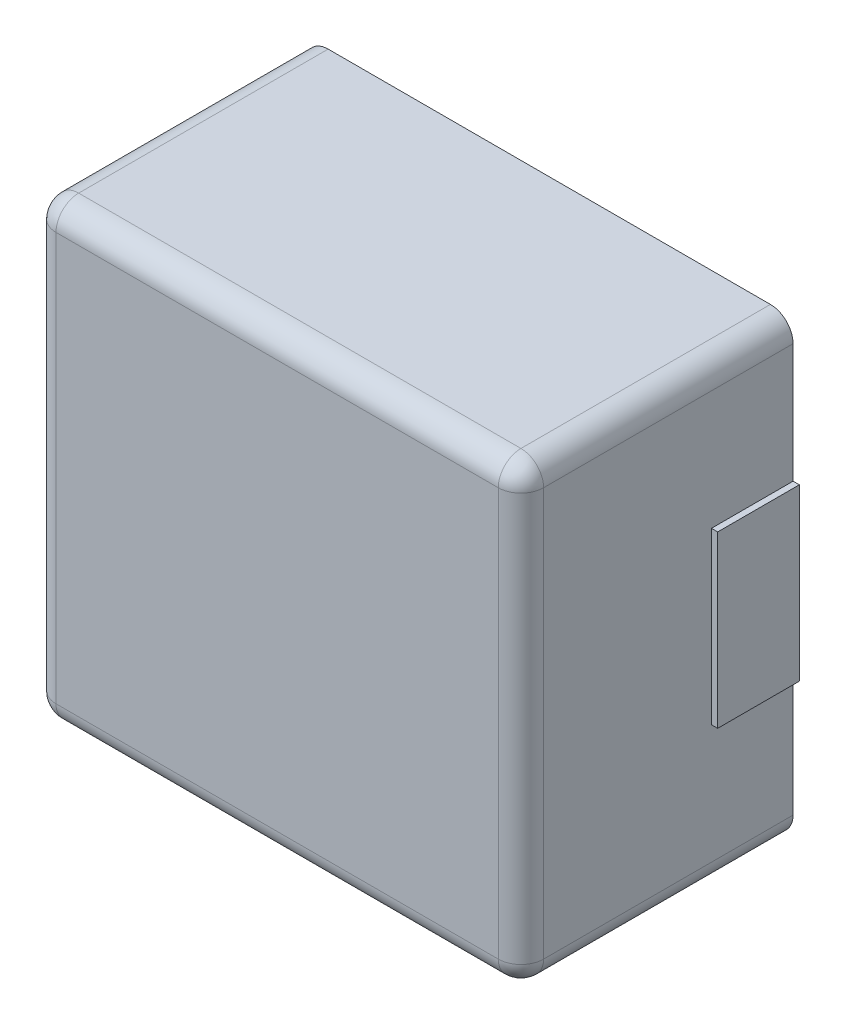
ISO-10303-21;
HEADER;
FILE_DESCRIPTION(('STEP AP214'),'2;1');
FILE_NAME('part.step','',(''),(''),'','','');
FILE_SCHEMA(('AUTOMOTIVE_DESIGN { 1 0 10303 214 1 1 1 1 }'));
ENDSEC;
DATA;
#1=APPLICATION_CONTEXT('core data for automotive mechanical design processes');
#2=APPLICATION_PROTOCOL_DEFINITION('international standard','automotive_design',2000,#1);
#3=PRODUCT_CONTEXT('',#1,'mechanical');
#4=PRODUCT('Part','Part','',(#3));
#5=PRODUCT_RELATED_PRODUCT_CATEGORY('part','',(#4));
#6=PRODUCT_DEFINITION_FORMATION('','',#4);
#7=PRODUCT_DEFINITION_CONTEXT('part definition',#1,'design');
#8=PRODUCT_DEFINITION('design','',#6,#7);
#9=PRODUCT_DEFINITION_SHAPE('','',#8);
#10=(LENGTH_UNIT() NAMED_UNIT(*) SI_UNIT(.MILLI.,.METRE.));
#11=(NAMED_UNIT(*) PLANE_ANGLE_UNIT() SI_UNIT($,.RADIAN.));
#12=(NAMED_UNIT(*) SI_UNIT($,.STERADIAN.) SOLID_ANGLE_UNIT());
#13=UNCERTAINTY_MEASURE_WITH_UNIT(LENGTH_MEASURE(1.E-05),#10,'distance_accuracy_value','');
#14=(GEOMETRIC_REPRESENTATION_CONTEXT(3) GLOBAL_UNCERTAINTY_ASSIGNED_CONTEXT((#13)) GLOBAL_UNIT_ASSIGNED_CONTEXT((#10,
#11,#12)) REPRESENTATION_CONTEXT('',''));
#15=CARTESIAN_POINT('',(0.,0.,0.));
#16=DIRECTION('',(0.,0.,1.));
#17=DIRECTION('',(1.,0.,0.));
#18=AXIS2_PLACEMENT_3D('',#15,#16,#17);
#19=CARTESIAN_POINT('',(3.9,-3.6,4.4));
#20=DIRECTION('',(0.,0.,-1.));
#21=DIRECTION('',(0.,-1.,0.));
#22=AXIS2_PLACEMENT_3D('',#19,#20,#21);
#23=SPHERICAL_SURFACE('',#22,0.4);
#24=CARTESIAN_POINT('',(3.9,-3.6,4.4));
#25=DIRECTION('',(0.,0.,1.));
#26=DIRECTION('',(0.,-1.,0.));
#27=AXIS2_PLACEMENT_3D('',#24,#25,#26);
#28=CIRCLE('',#27,0.4);
#29=CARTESIAN_POINT('',(3.9,-4.,4.4));
#30=VERTEX_POINT('',#29);
#31=CARTESIAN_POINT('',(4.3,-3.6,4.4));
#32=VERTEX_POINT('',#31);
#33=EDGE_CURVE('E131',#30,#32,#28,.T.);
#34=ORIENTED_EDGE('',*,*,#33,.T.);
#35=CARTESIAN_POINT('',(3.9,-3.6,4.4));
#36=DIRECTION('',(0.,1.,0.));
#37=DIRECTION('',(1.,0.,0.));
#38=AXIS2_PLACEMENT_3D('',#35,#36,#37);
#39=CIRCLE('',#38,0.4);
#40=CARTESIAN_POINT('',(3.9,-3.6,4.8));
#41=VERTEX_POINT('',#40);
#42=EDGE_CURVE('E261',#41,#32,#39,.T.);
#43=ORIENTED_EDGE('',*,*,#42,.F.);
#44=CARTESIAN_POINT('',(3.9,-3.6,4.4));
#45=DIRECTION('',(1.,0.,0.));
#46=DIRECTION('',(0.,0.,1.));
#47=AXIS2_PLACEMENT_3D('',#44,#45,#46);
#48=CIRCLE('',#47,0.4);
#49=EDGE_CURVE('E210',#41,#30,#48,.T.);
#50=ORIENTED_EDGE('',*,*,#49,.T.);
#51=EDGE_LOOP('',(#34,#43,#50));
#52=FACE_BOUND('',#51,.T.);
#53=ADVANCED_FACE('F17',(#52),#23,.T.);
#54=CARTESIAN_POINT('',(4.41,-1.5,0.));
#55=DIRECTION('',(1.,0.,0.));
#56=DIRECTION('',(0.,1.,0.));
#57=AXIS2_PLACEMENT_3D('',#54,#55,#56);
#58=PLANE('',#57);
#59=DIRECTION('',(0.,0.,1.));
#60=VECTOR('',#59,1.);
#61=CARTESIAN_POINT('',(4.41,-1.5,0.));
#62=LINE('',#61,#60);
#63=CARTESIAN_POINT('',(4.41,-1.5,0.));
#64=VERTEX_POINT('',#63);
#65=CARTESIAN_POINT('',(4.41,-1.5,1.44));
#66=VERTEX_POINT('',#65);
#67=EDGE_CURVE('E11',#64,#66,#62,.T.);
#68=ORIENTED_EDGE('',*,*,#67,.F.);
#69=DIRECTION('',(0.,1.,0.));
#70=VECTOR('',#69,1.);
#71=CARTESIAN_POINT('',(4.41,-1.5,0.));
#72=LINE('',#71,#70);
#73=CARTESIAN_POINT('',(4.41,1.5,0.));
#74=VERTEX_POINT('',#73);
#75=EDGE_CURVE('E119',#64,#74,#72,.T.);
#76=ORIENTED_EDGE('',*,*,#75,.T.);
#77=DIRECTION('',(0.,0.,1.));
#78=VECTOR('',#77,1.);
#79=CARTESIAN_POINT('',(4.41,1.5,0.));
#80=LINE('',#79,#78);
#81=CARTESIAN_POINT('',(4.41,1.5,1.44));
#82=VERTEX_POINT('',#81);
#83=EDGE_CURVE('E235',#74,#82,#80,.T.);
#84=ORIENTED_EDGE('',*,*,#83,.T.);
#85=DIRECTION('',(0.,1.,0.));
#86=VECTOR('',#85,1.);
#87=CARTESIAN_POINT('',(4.41,-1.5,1.44));
#88=LINE('',#87,#86);
#89=EDGE_CURVE('E25',#66,#82,#88,.T.);
#90=ORIENTED_EDGE('',*,*,#89,.F.);
#91=EDGE_LOOP('',(#68,#76,#84,#90));
#92=FACE_BOUND('',#91,.T.);
#93=ADVANCED_FACE('F117',(#92),#58,.T.);
#94=CARTESIAN_POINT('',(2.61,-1.5,0.));
#95=DIRECTION('',(0.,1.,0.));
#96=DIRECTION('',(1.,0.,0.));
#97=AXIS2_PLACEMENT_3D('',#94,#95,#96);
#98=PLANE('',#97);
#99=ORIENTED_EDGE('',*,*,#67,.T.);
#100=DIRECTION('',(1.,0.,0.));
#101=VECTOR('',#100,1.);
#102=CARTESIAN_POINT('',(2.61,-1.5,1.44));
#103=LINE('',#102,#101);
#104=CARTESIAN_POINT('',(4.3,-1.5,1.44));
#105=VERTEX_POINT('',#104);
#106=EDGE_CURVE('E232',#105,#66,#103,.T.);
#107=ORIENTED_EDGE('',*,*,#106,.F.);
#108=DIRECTION('',(0.,0.,1.));
#109=VECTOR('',#108,1.);
#110=CARTESIAN_POINT('',(4.3,-1.5,0.));
#111=LINE('',#110,#109);
#112=CARTESIAN_POINT('',(4.3,-1.5,0.));
#113=VERTEX_POINT('',#112);
#114=EDGE_CURVE('E126',#113,#105,#111,.T.);
#115=ORIENTED_EDGE('',*,*,#114,.F.);
#116=DIRECTION('',(1.,0.,0.));
#117=VECTOR('',#116,1.);
#118=CARTESIAN_POINT('',(2.61,-1.5,0.));
#119=LINE('',#118,#117);
#120=EDGE_CURVE('E123',#113,#64,#119,.T.);
#121=ORIENTED_EDGE('',*,*,#120,.T.);
#122=EDGE_LOOP('',(#99,#107,#115,#121));
#123=FACE_BOUND('',#122,.T.);
#124=ADVANCED_FACE('F124',(#123),#98,.F.);
#125=CARTESIAN_POINT('',(2.61,-1.5,1.44));
#126=DIRECTION('',(0.,0.,1.));
#127=DIRECTION('',(1.,0.,0.));
#128=AXIS2_PLACEMENT_3D('',#125,#126,#127);
#129=PLANE('',#128);
#130=DIRECTION('',(0.,-1.,0.));
#131=VECTOR('',#130,1.);
#132=CARTESIAN_POINT('',(4.3,-2.75,1.44));
#133=LINE('',#132,#131);
#134=CARTESIAN_POINT('',(4.3,1.5,1.44));
#135=VERTEX_POINT('',#134);
#136=EDGE_CURVE('E249',#135,#105,#133,.T.);
#137=ORIENTED_EDGE('',*,*,#136,.T.);
#138=ORIENTED_EDGE('',*,*,#106,.T.);
#139=ORIENTED_EDGE('',*,*,#89,.T.);
#140=DIRECTION('',(1.,0.,0.));
#141=VECTOR('',#140,1.);
#142=CARTESIAN_POINT('',(2.61,1.5,1.44));
#143=LINE('',#142,#141);
#144=EDGE_CURVE('E213',#135,#82,#143,.T.);
#145=ORIENTED_EDGE('',*,*,#144,.F.);
#146=EDGE_LOOP('',(#137,#138,#139,#145));
#147=FACE_BOUND('',#146,.T.);
#148=ADVANCED_FACE('F468',(#147),#129,.T.);
#149=CARTESIAN_POINT('',(2.61,1.5,0.));
#150=DIRECTION('',(0.,1.,0.));
#151=DIRECTION('',(1.,0.,0.));
#152=AXIS2_PLACEMENT_3D('',#149,#150,#151);
#153=PLANE('',#152);
#154=DIRECTION('',(1.,0.,0.));
#155=VECTOR('',#154,1.);
#156=CARTESIAN_POINT('',(2.61,1.5,0.));
#157=LINE('',#156,#155);
#158=CARTESIAN_POINT('',(4.3,1.5,0.));
#159=VERTEX_POINT('',#158);
#160=EDGE_CURVE('E136',#159,#74,#157,.T.);
#161=ORIENTED_EDGE('',*,*,#160,.F.);
#162=DIRECTION('',(0.,0.,1.));
#163=VECTOR('',#162,1.);
#164=CARTESIAN_POINT('',(4.3,1.5,0.));
#165=LINE('',#164,#163);
#166=EDGE_CURVE('E143',#159,#135,#165,.T.);
#167=ORIENTED_EDGE('',*,*,#166,.T.);
#168=ORIENTED_EDGE('',*,*,#144,.T.);
#169=ORIENTED_EDGE('',*,*,#83,.F.);
#170=EDGE_LOOP('',(#161,#167,#168,#169));
#171=FACE_BOUND('',#170,.T.);
#172=ADVANCED_FACE('F459',(#171),#153,.T.);
#173=CARTESIAN_POINT('',(3.9,3.6,4.4));
#174=DIRECTION('',(0.,0.,-1.));
#175=DIRECTION('',(1.,0.,0.));
#176=AXIS2_PLACEMENT_3D('',#173,#174,#175);
#177=SPHERICAL_SURFACE('',#176,0.4);
#178=CARTESIAN_POINT('',(3.9,3.6,4.4));
#179=DIRECTION('',(0.,0.,1.));
#180=DIRECTION('',(1.,0.,0.));
#181=AXIS2_PLACEMENT_3D('',#178,#179,#180);
#182=CIRCLE('',#181,0.4);
#183=CARTESIAN_POINT('',(4.3,3.6,4.4));
#184=VERTEX_POINT('',#183);
#185=CARTESIAN_POINT('',(3.9,4.,4.4));
#186=VERTEX_POINT('',#185);
#187=EDGE_CURVE('E160',#184,#186,#182,.T.);
#188=ORIENTED_EDGE('',*,*,#187,.T.);
#189=CARTESIAN_POINT('',(3.9,3.6,4.4));
#190=DIRECTION('',(-1.,0.,0.));
#191=DIRECTION('',(0.,1.,0.));
#192=AXIS2_PLACEMENT_3D('',#189,#190,#191);
#193=CIRCLE('',#192,0.4);
#194=CARTESIAN_POINT('',(3.9,3.6,4.8));
#195=VERTEX_POINT('',#194);
#196=EDGE_CURVE('E258',#195,#186,#193,.T.);
#197=ORIENTED_EDGE('',*,*,#196,.F.);
#198=CARTESIAN_POINT('',(3.9,3.6,4.4));
#199=DIRECTION('',(0.,1.,0.));
#200=DIRECTION('',(1.,0.,0.));
#201=AXIS2_PLACEMENT_3D('',#198,#199,#200);
#202=CIRCLE('',#201,0.4);
#203=EDGE_CURVE('E214',#195,#184,#202,.T.);
#204=ORIENTED_EDGE('',*,*,#203,.T.);
#205=EDGE_LOOP('',(#188,#197,#204));
#206=FACE_BOUND('',#205,.T.);
#207=ADVANCED_FACE('F450',(#206),#177,.T.);
#208=CARTESIAN_POINT('',(-3.9,-3.6,4.4));
#209=DIRECTION('',(1.,0.,0.));
#210=DIRECTION('',(0.,0.,1.));
#211=AXIS2_PLACEMENT_3D('',#208,#209,#210);
#212=CYLINDRICAL_SURFACE('',#211,0.4);
#213=CARTESIAN_POINT('',(-3.9,-3.6,4.4));
#214=DIRECTION('',(1.,0.,0.));
#215=DIRECTION('',(0.,-1.,0.));
#216=AXIS2_PLACEMENT_3D('',#213,#214,#215);
#217=CIRCLE('',#216,0.4);
#218=CARTESIAN_POINT('',(-3.9,-3.6,4.8));
#219=VERTEX_POINT('',#218);
#220=CARTESIAN_POINT('',(-3.9,-4.,4.4));
#221=VERTEX_POINT('',#220);
#222=EDGE_CURVE('E183',#219,#221,#217,.T.);
#223=ORIENTED_EDGE('',*,*,#222,.T.);
#224=DIRECTION('',(1.,0.,0.));
#225=VECTOR('',#224,1.);
#226=CARTESIAN_POINT('',(-3.9,-4.,4.4));
#227=LINE('',#226,#225);
#228=EDGE_CURVE('E257',#221,#30,#227,.T.);
#229=ORIENTED_EDGE('',*,*,#228,.T.);
#230=ORIENTED_EDGE('',*,*,#49,.F.);
#231=DIRECTION('',(1.,0.,0.));
#232=VECTOR('',#231,1.);
#233=CARTESIAN_POINT('',(-3.9,-3.6,4.8));
#234=LINE('',#233,#232);
#235=EDGE_CURVE('E231',#219,#41,#234,.T.);
#236=ORIENTED_EDGE('',*,*,#235,.F.);
#237=EDGE_LOOP('',(#223,#229,#230,#236));
#238=FACE_BOUND('',#237,.T.);
#239=ADVANCED_FACE('F441',(#238),#212,.T.);
#240=CARTESIAN_POINT('',(3.9,-3.6,4.4));
#241=DIRECTION('',(0.,1.,0.));
#242=DIRECTION('',(0.,0.,1.));
#243=AXIS2_PLACEMENT_3D('',#240,#241,#242);
#244=CYLINDRICAL_SURFACE('',#243,0.4);
#245=ORIENTED_EDGE('',*,*,#42,.T.);
#246=DIRECTION('',(0.,1.,0.));
#247=VECTOR('',#246,1.);
#248=CARTESIAN_POINT('',(4.3,-3.6,4.4));
#249=LINE('',#248,#247);
#250=EDGE_CURVE('E164',#32,#184,#249,.T.);
#251=ORIENTED_EDGE('',*,*,#250,.T.);
#252=ORIENTED_EDGE('',*,*,#203,.F.);
#253=DIRECTION('',(0.,1.,0.));
#254=VECTOR('',#253,1.);
#255=CARTESIAN_POINT('',(3.9,-3.6,4.8));
#256=LINE('',#255,#254);
#257=EDGE_CURVE('E239',#41,#195,#256,.T.);
#258=ORIENTED_EDGE('',*,*,#257,.F.);
#259=EDGE_LOOP('',(#245,#251,#252,#258));
#260=FACE_BOUND('',#259,.T.);
#261=ADVANCED_FACE('F432',(#260),#244,.T.);
#262=CARTESIAN_POINT('',(3.9,3.6,4.4));
#263=DIRECTION('',(-1.,0.,0.));
#264=DIRECTION('',(0.,0.,1.));
#265=AXIS2_PLACEMENT_3D('',#262,#263,#264);
#266=CYLINDRICAL_SURFACE('',#265,0.4);
#267=ORIENTED_EDGE('',*,*,#196,.T.);
#268=DIRECTION('',(-1.,0.,0.));
#269=VECTOR('',#268,1.);
#270=CARTESIAN_POINT('',(3.9,4.,4.4));
#271=LINE('',#270,#269);
#272=CARTESIAN_POINT('',(-3.9,4.,4.4));
#273=VERTEX_POINT('',#272);
#274=EDGE_CURVE('E178',#186,#273,#271,.T.);
#275=ORIENTED_EDGE('',*,*,#274,.T.);
#276=CARTESIAN_POINT('',(-3.9,3.6,4.4));
#277=DIRECTION('',(-1.,0.,0.));
#278=DIRECTION('',(0.,0.,1.));
#279=AXIS2_PLACEMENT_3D('',#276,#277,#278);
#280=CIRCLE('',#279,0.4);
#281=CARTESIAN_POINT('',(-3.9,3.6,4.8));
#282=VERTEX_POINT('',#281);
#283=EDGE_CURVE('E226',#282,#273,#280,.T.);
#284=ORIENTED_EDGE('',*,*,#283,.F.);
#285=DIRECTION('',(-1.,0.,0.));
#286=VECTOR('',#285,1.);
#287=CARTESIAN_POINT('',(3.9,3.6,4.8));
#288=LINE('',#287,#286);
#289=EDGE_CURVE('E227',#195,#282,#288,.T.);
#290=ORIENTED_EDGE('',*,*,#289,.F.);
#291=EDGE_LOOP('',(#267,#275,#284,#290));
#292=FACE_BOUND('',#291,.T.);
#293=ADVANCED_FACE('F423',(#292),#266,.T.);
#294=CARTESIAN_POINT('',(-4.41,-1.5,0.));
#295=DIRECTION('',(1.,0.,0.));
#296=DIRECTION('',(0.,1.,0.));
#297=AXIS2_PLACEMENT_3D('',#294,#295,#296);
#298=PLANE('',#297);
#299=DIRECTION('',(0.,1.,0.));
#300=VECTOR('',#299,1.);
#301=CARTESIAN_POINT('',(-4.41,-1.5,1.44));
#302=LINE('',#301,#300);
#303=CARTESIAN_POINT('',(-4.41,-1.5,1.44));
#304=VERTEX_POINT('',#303);
#305=CARTESIAN_POINT('',(-4.41,1.5,1.44));
#306=VERTEX_POINT('',#305);
#307=EDGE_CURVE('E195',#304,#306,#302,.T.);
#308=ORIENTED_EDGE('',*,*,#307,.T.);
#309=DIRECTION('',(0.,0.,1.));
#310=VECTOR('',#309,1.);
#311=CARTESIAN_POINT('',(-4.41,1.5,0.));
#312=LINE('',#311,#310);
#313=CARTESIAN_POINT('',(-4.41,1.5,0.));
#314=VERTEX_POINT('',#313);
#315=EDGE_CURVE('E187',#314,#306,#312,.T.);
#316=ORIENTED_EDGE('',*,*,#315,.F.);
#317=DIRECTION('',(0.,1.,0.));
#318=VECTOR('',#317,1.);
#319=CARTESIAN_POINT('',(-4.41,-1.5,0.));
#320=LINE('',#319,#318);
#321=CARTESIAN_POINT('',(-4.41,-1.5,0.));
#322=VERTEX_POINT('',#321);
#323=EDGE_CURVE('E246',#322,#314,#320,.T.);
#324=ORIENTED_EDGE('',*,*,#323,.F.);
#325=DIRECTION('',(0.,0.,1.));
#326=VECTOR('',#325,1.);
#327=CARTESIAN_POINT('',(-4.41,-1.5,0.));
#328=LINE('',#327,#326);
#329=EDGE_CURVE('E202',#322,#304,#328,.T.);
#330=ORIENTED_EDGE('',*,*,#329,.T.);
#331=EDGE_LOOP('',(#308,#316,#324,#330));
#332=FACE_BOUND('',#331,.T.);
#333=ADVANCED_FACE('F414',(#332),#298,.F.);
#334=CARTESIAN_POINT('',(-4.3,-4.,0.));
#335=DIRECTION('',(0.,1.,0.));
#336=DIRECTION('',(1.,0.,0.));
#337=AXIS2_PLACEMENT_3D('',#334,#335,#336);
#338=PLANE('',#337);
#339=DIRECTION('',(1.,0.,0.));
#340=VECTOR('',#339,1.);
#341=CARTESIAN_POINT('',(-4.3,-4.,0.));
#342=LINE('',#341,#340);
#343=CARTESIAN_POINT('',(-3.9,-4.,0.));
#344=VERTEX_POINT('',#343);
#345=CARTESIAN_POINT('',(3.9,-4.,0.));
#346=VERTEX_POINT('',#345);
#347=EDGE_CURVE('E169',#344,#346,#342,.T.);
#348=ORIENTED_EDGE('',*,*,#347,.T.);
#349=DIRECTION('',(0.,0.,1.));
#350=VECTOR('',#349,1.);
#351=CARTESIAN_POINT('',(3.9,-4.,0.));
#352=LINE('',#351,#350);
#353=EDGE_CURVE('E253',#346,#30,#352,.T.);
#354=ORIENTED_EDGE('',*,*,#353,.T.);
#355=ORIENTED_EDGE('',*,*,#228,.F.);
#356=DIRECTION('',(0.,0.,1.));
#357=VECTOR('',#356,1.);
#358=CARTESIAN_POINT('',(-3.9,-4.,0.));
#359=LINE('',#358,#357);
#360=EDGE_CURVE('E209',#344,#221,#359,.T.);
#361=ORIENTED_EDGE('',*,*,#360,.F.);
#362=EDGE_LOOP('',(#348,#354,#355,#361));
#363=FACE_BOUND('',#362,.T.);
#364=ADVANCED_FACE('F405',(#363),#338,.F.);
#365=CARTESIAN_POINT('',(3.9,-3.6,0.));
#366=DIRECTION('',(0.,0.,1.));
#367=DIRECTION('',(1.,0.,0.));
#368=AXIS2_PLACEMENT_3D('',#365,#366,#367);
#369=CYLINDRICAL_SURFACE('',#368,0.4);
#370=ORIENTED_EDGE('',*,*,#33,.F.);
#371=ORIENTED_EDGE('',*,*,#353,.F.);
#372=CARTESIAN_POINT('',(3.9,-3.6,0.));
#373=DIRECTION('',(0.,0.,-1.));
#374=DIRECTION('',(0.,-1.,0.));
#375=AXIS2_PLACEMENT_3D('',#372,#373,#374);
#376=CIRCLE('',#375,0.4);
#377=CARTESIAN_POINT('',(4.3,-3.6,0.));
#378=VERTEX_POINT('',#377);
#379=EDGE_CURVE('E159',#378,#346,#376,.T.);
#380=ORIENTED_EDGE('',*,*,#379,.F.);
#381=DIRECTION('',(0.,0.,1.));
#382=VECTOR('',#381,1.);
#383=CARTESIAN_POINT('',(4.3,-3.6,0.));
#384=LINE('',#383,#382);
#385=EDGE_CURVE('E218',#378,#32,#384,.T.);
#386=ORIENTED_EDGE('',*,*,#385,.T.);
#387=EDGE_LOOP('',(#370,#371,#380,#386));
#388=FACE_BOUND('',#387,.T.);
#389=ADVANCED_FACE('F353',(#388),#369,.T.);
#390=CARTESIAN_POINT('',(4.3,-4.,0.));
#391=DIRECTION('',(1.,0.,0.));
#392=DIRECTION('',(0.,1.,0.));
#393=AXIS2_PLACEMENT_3D('',#390,#391,#392);
#394=PLANE('',#393);
#395=ORIENTED_EDGE('',*,*,#250,.F.);
#396=ORIENTED_EDGE('',*,*,#385,.F.);
#397=DIRECTION('',(0.,1.,0.));
#398=VECTOR('',#397,1.);
#399=CARTESIAN_POINT('',(4.3,-4.,0.));
#400=LINE('',#399,#398);
#401=EDGE_CURVE('E156',#378,#113,#400,.T.);
#402=ORIENTED_EDGE('',*,*,#401,.T.);
#403=ORIENTED_EDGE('',*,*,#114,.T.);
#404=ORIENTED_EDGE('',*,*,#136,.F.);
#405=ORIENTED_EDGE('',*,*,#166,.F.);
#406=DIRECTION('',(0.,1.,0.));
#407=VECTOR('',#406,1.);
#408=CARTESIAN_POINT('',(4.3,-4.,0.));
#409=LINE('',#408,#407);
#410=CARTESIAN_POINT('',(4.3,3.6,0.));
#411=VERTEX_POINT('',#410);
#412=EDGE_CURVE('E152',#159,#411,#409,.T.);
#413=ORIENTED_EDGE('',*,*,#412,.T.);
#414=DIRECTION('',(0.,0.,1.));
#415=VECTOR('',#414,1.);
#416=CARTESIAN_POINT('',(4.3,3.6,0.));
#417=LINE('',#416,#415);
#418=EDGE_CURVE('E165',#411,#184,#417,.T.);
#419=ORIENTED_EDGE('',*,*,#418,.T.);
#420=EDGE_LOOP('',(#395,#396,#402,#403,#404,#405,#413,#419));
#421=FACE_BOUND('',#420,.T.);
#422=ADVANCED_FACE('F348',(#421),#394,.T.);
#423=CARTESIAN_POINT('',(3.9,3.6,0.));
#424=DIRECTION('',(0.,0.,1.));
#425=DIRECTION('',(1.,0.,0.));
#426=AXIS2_PLACEMENT_3D('',#423,#424,#425);
#427=CYLINDRICAL_SURFACE('',#426,0.4);
#428=ORIENTED_EDGE('',*,*,#418,.F.);
#429=CARTESIAN_POINT('',(3.9,3.6,0.));
#430=DIRECTION('',(0.,0.,1.));
#431=DIRECTION('',(0.,-1.,0.));
#432=AXIS2_PLACEMENT_3D('',#429,#430,#431);
#433=CIRCLE('',#432,0.4);
#434=CARTESIAN_POINT('',(3.9,4.,0.));
#435=VERTEX_POINT('',#434);
#436=EDGE_CURVE('E149',#411,#435,#433,.T.);
#437=ORIENTED_EDGE('',*,*,#436,.T.);
#438=DIRECTION('',(0.,0.,1.));
#439=VECTOR('',#438,1.);
#440=CARTESIAN_POINT('',(3.9,4.,0.));
#441=LINE('',#440,#439);
#442=EDGE_CURVE('E182',#435,#186,#441,.T.);
#443=ORIENTED_EDGE('',*,*,#442,.T.);
#444=ORIENTED_EDGE('',*,*,#187,.F.);
#445=EDGE_LOOP('',(#428,#437,#443,#444));
#446=FACE_BOUND('',#445,.T.);
#447=ADVANCED_FACE('F352',(#446),#427,.T.);
#448=CARTESIAN_POINT('',(-4.3,4.,0.));
#449=DIRECTION('',(0.,1.,0.));
#450=DIRECTION('',(1.,0.,0.));
#451=AXIS2_PLACEMENT_3D('',#448,#449,#450);
#452=PLANE('',#451);
#453=DIRECTION('',(0.,0.,1.));
#454=VECTOR('',#453,1.);
#455=CARTESIAN_POINT('',(-3.9,4.,0.));
#456=LINE('',#455,#454);
#457=CARTESIAN_POINT('',(-3.9,4.,0.));
#458=VERTEX_POINT('',#457);
#459=EDGE_CURVE('E601',#458,#273,#456,.T.);
#460=ORIENTED_EDGE('',*,*,#459,.T.);
#461=ORIENTED_EDGE('',*,*,#274,.F.);
#462=ORIENTED_EDGE('',*,*,#442,.F.);
#463=DIRECTION('',(1.,0.,0.));
#464=VECTOR('',#463,1.);
#465=CARTESIAN_POINT('',(-4.3,4.,0.));
#466=LINE('',#465,#464);
#467=EDGE_CURVE('E147',#458,#435,#466,.T.);
#468=ORIENTED_EDGE('',*,*,#467,.F.);
#469=EDGE_LOOP('',(#460,#461,#462,#468));
#470=FACE_BOUND('',#469,.T.);
#471=ADVANCED_FACE('F380',(#470),#452,.T.);
#472=CARTESIAN_POINT('',(-3.9,-3.6,4.4));
#473=DIRECTION('',(0.,0.,-1.));
#474=DIRECTION('',(-1.,0.,0.));
#475=AXIS2_PLACEMENT_3D('',#472,#473,#474);
#476=SPHERICAL_SURFACE('',#475,0.4);
#477=CARTESIAN_POINT('',(-3.9,-3.6,4.4));
#478=DIRECTION('',(0.,0.,1.));
#479=DIRECTION('',(-1.,0.,0.));
#480=AXIS2_PLACEMENT_3D('',#477,#478,#479);
#481=CIRCLE('',#480,0.4);
#482=CARTESIAN_POINT('',(-4.3,-3.6,4.4));
#483=VERTEX_POINT('',#482);
#484=EDGE_CURVE('E222',#483,#221,#481,.T.);
#485=ORIENTED_EDGE('',*,*,#484,.T.);
#486=ORIENTED_EDGE('',*,*,#222,.F.);
#487=CARTESIAN_POINT('',(-3.9,-3.6,4.4));
#488=DIRECTION('',(0.,-1.,0.));
#489=DIRECTION('',(0.,0.,1.));
#490=AXIS2_PLACEMENT_3D('',#487,#488,#489);
#491=CIRCLE('',#490,0.4);
#492=EDGE_CURVE('E607',#219,#483,#491,.T.);
#493=ORIENTED_EDGE('',*,*,#492,.T.);
#494=EDGE_LOOP('',(#485,#486,#493));
#495=FACE_BOUND('',#494,.T.);
#496=ADVANCED_FACE('F371',(#495),#476,.T.);
#497=CARTESIAN_POINT('',(-4.3,-4.,4.8));
#498=DIRECTION('',(0.,0.,1.));
#499=DIRECTION('',(1.,0.,0.));
#500=AXIS2_PLACEMENT_3D('',#497,#498,#499);
#501=PLANE('',#500);
#502=ORIENTED_EDGE('',*,*,#289,.T.);
#503=DIRECTION('',(0.,-1.,0.));
#504=VECTOR('',#503,1.);
#505=CARTESIAN_POINT('',(-3.9,3.6,4.8));
#506=LINE('',#505,#504);
#507=EDGE_CURVE('E602',#282,#219,#506,.T.);
#508=ORIENTED_EDGE('',*,*,#507,.T.);
#509=ORIENTED_EDGE('',*,*,#235,.T.);
#510=ORIENTED_EDGE('',*,*,#257,.T.);
#511=EDGE_LOOP('',(#502,#508,#509,#510));
#512=FACE_BOUND('',#511,.T.);
#513=ADVANCED_FACE('F362',(#512),#501,.T.);
#514=CARTESIAN_POINT('',(-3.9,3.6,4.4));
#515=DIRECTION('',(0.,0.,-1.));
#516=DIRECTION('',(0.,1.,0.));
#517=AXIS2_PLACEMENT_3D('',#514,#515,#516);
#518=SPHERICAL_SURFACE('',#517,0.4);
#519=CARTESIAN_POINT('',(-3.9,3.6,4.4));
#520=DIRECTION('',(0.,0.,1.));
#521=DIRECTION('',(0.,1.,0.));
#522=AXIS2_PLACEMENT_3D('',#519,#520,#521);
#523=CIRCLE('',#522,0.4);
#524=CARTESIAN_POINT('',(-4.3,3.6,4.4));
#525=VERTEX_POINT('',#524);
#526=EDGE_CURVE('E599',#273,#525,#523,.T.);
#527=ORIENTED_EDGE('',*,*,#526,.T.);
#528=CARTESIAN_POINT('',(-3.9,3.6,4.4));
#529=DIRECTION('',(0.,-1.,0.));
#530=DIRECTION('',(-1.,0.,0.));
#531=AXIS2_PLACEMENT_3D('',#528,#529,#530);
#532=CIRCLE('',#531,0.4);
#533=EDGE_CURVE('E603',#282,#525,#532,.T.);
#534=ORIENTED_EDGE('',*,*,#533,.F.);
#535=ORIENTED_EDGE('',*,*,#283,.T.);
#536=EDGE_LOOP('',(#527,#534,#535));
#537=FACE_BOUND('',#536,.T.);
#538=ADVANCED_FACE('F342',(#537),#518,.T.);
#539=CARTESIAN_POINT('',(-3.9,-3.6,0.));
#540=DIRECTION('',(0.,0.,1.));
#541=DIRECTION('',(-1.,0.,0.));
#542=AXIS2_PLACEMENT_3D('',#539,#540,#541);
#543=CYLINDRICAL_SURFACE('',#542,0.4);
#544=DIRECTION('',(0.,0.,1.));
#545=VECTOR('',#544,1.);
#546=CARTESIAN_POINT('',(-4.3,-3.6,0.));
#547=LINE('',#546,#545);
#548=CARTESIAN_POINT('',(-4.3,-3.6,0.));
#549=VERTEX_POINT('',#548);
#550=EDGE_CURVE('E597',#549,#483,#547,.T.);
#551=ORIENTED_EDGE('',*,*,#550,.F.);
#552=CARTESIAN_POINT('',(-3.9,-3.6,0.));
#553=DIRECTION('',(0.,0.,1.));
#554=DIRECTION('',(0.,-1.,0.));
#555=AXIS2_PLACEMENT_3D('',#552,#553,#554);
#556=CIRCLE('',#555,0.4);
#557=EDGE_CURVE('E173',#549,#344,#556,.T.);
#558=ORIENTED_EDGE('',*,*,#557,.T.);
#559=ORIENTED_EDGE('',*,*,#360,.T.);
#560=ORIENTED_EDGE('',*,*,#484,.F.);
#561=EDGE_LOOP('',(#551,#558,#559,#560));
#562=FACE_BOUND('',#561,.T.);
#563=ADVANCED_FACE('F333',(#562),#543,.T.);
#564=CARTESIAN_POINT('',(-4.41,-1.5,0.));
#565=DIRECTION('',(0.,1.,0.));
#566=DIRECTION('',(1.,0.,0.));
#567=AXIS2_PLACEMENT_3D('',#564,#565,#566);
#568=PLANE('',#567);
#569=DIRECTION('',(0.,0.,1.));
#570=VECTOR('',#569,1.);
#571=CARTESIAN_POINT('',(-4.3,-1.5,0.));
#572=LINE('',#571,#570);
#573=CARTESIAN_POINT('',(-4.3,-1.5,0.));
#574=VERTEX_POINT('',#573);
#575=CARTESIAN_POINT('',(-4.3,-1.5,1.44));
#576=VERTEX_POINT('',#575);
#577=EDGE_CURVE('E660',#574,#576,#572,.T.);
#578=ORIENTED_EDGE('',*,*,#577,.T.);
#579=DIRECTION('',(1.,0.,0.));
#580=VECTOR('',#579,1.);
#581=CARTESIAN_POINT('',(-4.41,-1.5,1.44));
#582=LINE('',#581,#580);
#583=EDGE_CURVE('E198',#304,#576,#582,.T.);
#584=ORIENTED_EDGE('',*,*,#583,.F.);
#585=ORIENTED_EDGE('',*,*,#329,.F.);
#586=DIRECTION('',(1.,0.,0.));
#587=VECTOR('',#586,1.);
#588=CARTESIAN_POINT('',(-4.41,-1.5,0.));
#589=LINE('',#588,#587);
#590=EDGE_CURVE('E205',#322,#574,#589,.T.);
#591=ORIENTED_EDGE('',*,*,#590,.T.);
#592=EDGE_LOOP('',(#578,#584,#585,#591));
#593=FACE_BOUND('',#592,.T.);
#594=ADVANCED_FACE('F281',(#593),#568,.F.);
#595=CARTESIAN_POINT('',(-4.41,-1.5,1.44));
#596=DIRECTION('',(0.,0.,1.));
#597=DIRECTION('',(1.,0.,0.));
#598=AXIS2_PLACEMENT_3D('',#595,#596,#597);
#599=PLANE('',#598);
#600=DIRECTION('',(1.,0.,0.));
#601=VECTOR('',#600,1.);
#602=CARTESIAN_POINT('',(-4.41,1.5,1.44));
#603=LINE('',#602,#601);
#604=CARTESIAN_POINT('',(-4.3,1.5,1.44));
#605=VERTEX_POINT('',#604);
#606=EDGE_CURVE('E191',#306,#605,#603,.T.);
#607=ORIENTED_EDGE('',*,*,#606,.F.);
#608=ORIENTED_EDGE('',*,*,#307,.F.);
#609=ORIENTED_EDGE('',*,*,#583,.T.);
#610=DIRECTION('',(0.,-1.,0.));
#611=VECTOR('',#610,1.);
#612=CARTESIAN_POINT('',(-4.3,-2.75,1.44));
#613=LINE('',#612,#611);
#614=EDGE_CURVE('E654',#605,#576,#613,.T.);
#615=ORIENTED_EDGE('',*,*,#614,.F.);
#616=EDGE_LOOP('',(#607,#608,#609,#615));
#617=FACE_BOUND('',#616,.T.);
#618=ADVANCED_FACE('F275',(#617),#599,.T.);
#619=CARTESIAN_POINT('',(-4.41,1.5,0.));
#620=DIRECTION('',(0.,1.,0.));
#621=DIRECTION('',(1.,0.,0.));
#622=AXIS2_PLACEMENT_3D('',#619,#620,#621);
#623=PLANE('',#622);
#624=DIRECTION('',(1.,0.,0.));
#625=VECTOR('',#624,1.);
#626=CARTESIAN_POINT('',(-4.41,1.5,0.));
#627=LINE('',#626,#625);
#628=CARTESIAN_POINT('',(-4.3,1.5,0.));
#629=VERTEX_POINT('',#628);
#630=EDGE_CURVE('E177',#314,#629,#627,.T.);
#631=ORIENTED_EDGE('',*,*,#630,.F.);
#632=ORIENTED_EDGE('',*,*,#315,.T.);
#633=ORIENTED_EDGE('',*,*,#606,.T.);
#634=DIRECTION('',(0.,0.,1.));
#635=VECTOR('',#634,1.);
#636=CARTESIAN_POINT('',(-4.3,1.5,0.));
#637=LINE('',#636,#635);
#638=EDGE_CURVE('E636',#629,#605,#637,.T.);
#639=ORIENTED_EDGE('',*,*,#638,.F.);
#640=EDGE_LOOP('',(#631,#632,#633,#639));
#641=FACE_BOUND('',#640,.T.);
#642=ADVANCED_FACE('F280',(#641),#623,.T.);
#643=CARTESIAN_POINT('',(-4.3,-4.,0.));
#644=DIRECTION('',(0.,0.,1.));
#645=DIRECTION('',(1.,0.,0.));
#646=AXIS2_PLACEMENT_3D('',#643,#644,#645);
#647=PLANE('',#646);
#648=ORIENTED_EDGE('',*,*,#412,.F.);
#649=ORIENTED_EDGE('',*,*,#160,.T.);
#650=ORIENTED_EDGE('',*,*,#75,.F.);
#651=ORIENTED_EDGE('',*,*,#120,.F.);
#652=ORIENTED_EDGE('',*,*,#401,.F.);
#653=ORIENTED_EDGE('',*,*,#379,.T.);
#654=ORIENTED_EDGE('',*,*,#347,.F.);
#655=ORIENTED_EDGE('',*,*,#557,.F.);
#656=DIRECTION('',(0.,1.,0.));
#657=VECTOR('',#656,1.);
#658=CARTESIAN_POINT('',(-4.3,-4.,0.));
#659=LINE('',#658,#657);
#660=EDGE_CURVE('E668',#549,#574,#659,.T.);
#661=ORIENTED_EDGE('',*,*,#660,.T.);
#662=ORIENTED_EDGE('',*,*,#590,.F.);
#663=ORIENTED_EDGE('',*,*,#323,.T.);
#664=ORIENTED_EDGE('',*,*,#630,.T.);
#665=DIRECTION('',(0.,1.,0.));
#666=VECTOR('',#665,1.);
#667=CARTESIAN_POINT('',(-4.3,-4.,0.));
#668=LINE('',#667,#666);
#669=CARTESIAN_POINT('',(-4.3,3.6,0.));
#670=VERTEX_POINT('',#669);
#671=EDGE_CURVE('E630',#629,#670,#668,.T.);
#672=ORIENTED_EDGE('',*,*,#671,.T.);
#673=CARTESIAN_POINT('',(-3.9,3.6,0.));
#674=DIRECTION('',(0.,0.,-1.));
#675=DIRECTION('',(0.,-1.,0.));
#676=AXIS2_PLACEMENT_3D('',#673,#674,#675);
#677=CIRCLE('',#676,0.4);
#678=EDGE_CURVE('E612',#670,#458,#677,.T.);
#679=ORIENTED_EDGE('',*,*,#678,.T.);
#680=ORIENTED_EDGE('',*,*,#467,.T.);
#681=ORIENTED_EDGE('',*,*,#436,.F.);
#682=EDGE_LOOP('',(#648,#649,#650,#651,#652,#653,#654,#655,#661,#662,#663,#664,#672,#679,#680,#681));
#683=FACE_BOUND('',#682,.T.);
#684=ADVANCED_FACE('F134',(#683),#647,.F.);
#685=CARTESIAN_POINT('',(-3.9,3.6,0.));
#686=DIRECTION('',(0.,0.,1.));
#687=DIRECTION('',(-1.,0.,0.));
#688=AXIS2_PLACEMENT_3D('',#685,#686,#687);
#689=CYLINDRICAL_SURFACE('',#688,0.4);
#690=ORIENTED_EDGE('',*,*,#526,.F.);
#691=ORIENTED_EDGE('',*,*,#459,.F.);
#692=ORIENTED_EDGE('',*,*,#678,.F.);
#693=DIRECTION('',(0.,0.,1.));
#694=VECTOR('',#693,1.);
#695=CARTESIAN_POINT('',(-4.3,3.6,0.));
#696=LINE('',#695,#694);
#697=EDGE_CURVE('E625',#670,#525,#696,.T.);
#698=ORIENTED_EDGE('',*,*,#697,.T.);
#699=EDGE_LOOP('',(#690,#691,#692,#698));
#700=FACE_BOUND('',#699,.T.);
#701=ADVANCED_FACE('F301',(#700),#689,.T.);
#702=CARTESIAN_POINT('',(-3.9,3.6,4.4));
#703=DIRECTION('',(0.,-1.,0.));
#704=DIRECTION('',(0.,0.,1.));
#705=AXIS2_PLACEMENT_3D('',#702,#703,#704);
#706=CYLINDRICAL_SURFACE('',#705,0.4);
#707=ORIENTED_EDGE('',*,*,#533,.T.);
#708=DIRECTION('',(0.,-1.,0.));
#709=VECTOR('',#708,1.);
#710=CARTESIAN_POINT('',(-4.3,3.6,4.4));
#711=LINE('',#710,#709);
#712=EDGE_CURVE('E608',#525,#483,#711,.T.);
#713=ORIENTED_EDGE('',*,*,#712,.T.);
#714=ORIENTED_EDGE('',*,*,#492,.F.);
#715=ORIENTED_EDGE('',*,*,#507,.F.);
#716=EDGE_LOOP('',(#707,#713,#714,#715));
#717=FACE_BOUND('',#716,.T.);
#718=ADVANCED_FACE('F292',(#717),#706,.T.);
#719=CARTESIAN_POINT('',(-4.3,-4.,0.));
#720=DIRECTION('',(1.,0.,0.));
#721=DIRECTION('',(0.,1.,0.));
#722=AXIS2_PLACEMENT_3D('',#719,#720,#721);
#723=PLANE('',#722);
#724=ORIENTED_EDGE('',*,*,#697,.F.);
#725=ORIENTED_EDGE('',*,*,#671,.F.);
#726=ORIENTED_EDGE('',*,*,#638,.T.);
#727=ORIENTED_EDGE('',*,*,#614,.T.);
#728=ORIENTED_EDGE('',*,*,#577,.F.);
#729=ORIENTED_EDGE('',*,*,#660,.F.);
#730=ORIENTED_EDGE('',*,*,#550,.T.);
#731=ORIENTED_EDGE('',*,*,#712,.F.);
#732=EDGE_LOOP('',(#724,#725,#726,#727,#728,#729,#730,#731));
#733=FACE_BOUND('',#732,.T.);
#734=ADVANCED_FACE('F288',(#733),#723,.F.);
#735=CLOSED_SHELL('',(#53,#93,#124,#148,#172,#207,#239,#261,#293,#333,#364,#389,#422,#447,#471,
#496,#513,#538,#563,#594,#618,#642,#684,#701,#718,#734));
#736=MANIFOLD_SOLID_BREP('B1',#735);
#737=ADVANCED_BREP_SHAPE_REPRESENTATION('',(#18,#736),#14);
#738=SHAPE_DEFINITION_REPRESENTATION(#9,#737);
ENDSEC;
END-ISO-10303-21;
